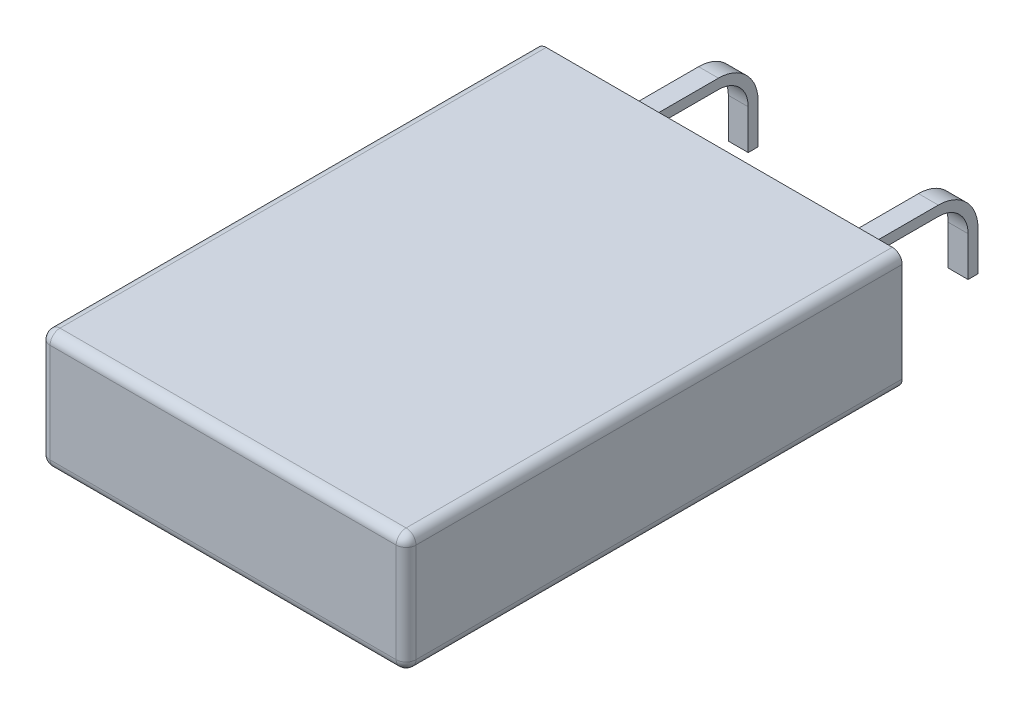
ISO-10303-21;
HEADER;
FILE_DESCRIPTION(('STEP AP214'),'2;1');
FILE_NAME('part.step','',(''),(''),'','','');
FILE_SCHEMA(('AUTOMOTIVE_DESIGN { 1 0 10303 214 1 1 1 1 }'));
ENDSEC;
DATA;
#1=APPLICATION_CONTEXT('core data for automotive mechanical design processes');
#2=APPLICATION_PROTOCOL_DEFINITION('international standard','automotive_design',2000,#1);
#3=PRODUCT_CONTEXT('',#1,'mechanical');
#4=PRODUCT('Part','Part','',(#3));
#5=PRODUCT_RELATED_PRODUCT_CATEGORY('part','',(#4));
#6=PRODUCT_DEFINITION_FORMATION('','',#4);
#7=PRODUCT_DEFINITION_CONTEXT('part definition',#1,'design');
#8=PRODUCT_DEFINITION('design','',#6,#7);
#9=PRODUCT_DEFINITION_SHAPE('','',#8);
#10=(LENGTH_UNIT() NAMED_UNIT(*) SI_UNIT(.MILLI.,.METRE.));
#11=(NAMED_UNIT(*) PLANE_ANGLE_UNIT() SI_UNIT($,.RADIAN.));
#12=(NAMED_UNIT(*) SI_UNIT($,.STERADIAN.) SOLID_ANGLE_UNIT());
#13=UNCERTAINTY_MEASURE_WITH_UNIT(LENGTH_MEASURE(1.E-05),#10,'distance_accuracy_value','');
#14=(GEOMETRIC_REPRESENTATION_CONTEXT(3) GLOBAL_UNCERTAINTY_ASSIGNED_CONTEXT((#13)) GLOBAL_UNIT_ASSIGNED_CONTEXT((#10,
#11,#12)) REPRESENTATION_CONTEXT('',''));
#15=CARTESIAN_POINT('',(0.,0.,0.));
#16=DIRECTION('',(0.,0.,1.));
#17=DIRECTION('',(1.,0.,0.));
#18=AXIS2_PLACEMENT_3D('',#15,#16,#17);
#19=CARTESIAN_POINT('',(17.44,5.,-20.));
#20=DIRECTION('',(0.,0.,-1.));
#21=DIRECTION('',(-1.,0.,0.));
#22=AXIS2_PLACEMENT_3D('',#19,#20,#21);
#23=PLANE('',#22);
#24=DIRECTION('',(1.,0.,0.));
#25=VECTOR('',#24,1.);
#26=CARTESIAN_POINT('',(1.,5.,-20.));
#27=LINE('',#26,#25);
#28=CARTESIAN_POINT('',(1.,5.,-20.));
#29=VERTEX_POINT('',#28);
#30=CARTESIAN_POINT('',(17.44,5.,-20.));
#31=VERTEX_POINT('',#30);
#32=EDGE_CURVE('E371',#29,#31,#27,.T.);
#33=ORIENTED_EDGE('',*,*,#32,.T.);
#34=DIRECTION('',(0.,-1.,0.));
#35=VECTOR('',#34,1.);
#36=CARTESIAN_POINT('',(17.44,5.,-20.));
#37=LINE('',#36,#35);
#38=CARTESIAN_POINT('',(17.44,1.,-20.));
#39=VERTEX_POINT('',#38);
#40=EDGE_CURVE('E374',#31,#39,#37,.T.);
#41=ORIENTED_EDGE('',*,*,#40,.T.);
#42=DIRECTION('',(-1.,0.,0.));
#43=VECTOR('',#42,1.);
#44=CARTESIAN_POINT('',(17.44,1.,-20.));
#45=LINE('',#44,#43);
#46=CARTESIAN_POINT('',(1.,1.,-20.));
#47=VERTEX_POINT('',#46);
#48=EDGE_CURVE('E378',#39,#47,#45,.T.);
#49=ORIENTED_EDGE('',*,*,#48,.T.);
#50=DIRECTION('',(0.,1.,0.));
#51=VECTOR('',#50,1.);
#52=CARTESIAN_POINT('',(1.,1.,-20.));
#53=LINE('',#52,#51);
#54=EDGE_CURVE('E381',#47,#29,#53,.T.);
#55=ORIENTED_EDGE('',*,*,#54,.T.);
#56=EDGE_LOOP('',(#33,#41,#49,#55));
#57=FACE_BOUND('',#56,.T.);
#58=DIRECTION('',(-1.,0.,0.));
#59=VECTOR('',#58,1.);
#60=CARTESIAN_POINT('',(15.26,3.5,-20.));
#61=LINE('',#60,#59);
#62=CARTESIAN_POINT('',(15.26,3.5,-20.));
#63=VERTEX_POINT('',#62);
#64=CARTESIAN_POINT('',(14.26,3.5,-20.));
#65=VERTEX_POINT('',#64);
#66=EDGE_CURVE('E315',#63,#65,#61,.T.);
#67=ORIENTED_EDGE('',*,*,#66,.F.);
#68=DIRECTION('',(0.,-1.,0.));
#69=VECTOR('',#68,1.);
#70=CARTESIAN_POINT('',(15.26,4.,-20.));
#71=LINE('',#70,#69);
#72=CARTESIAN_POINT('',(15.26,4.,-20.));
#73=VERTEX_POINT('',#72);
#74=EDGE_CURVE('E304',#73,#63,#71,.T.);
#75=ORIENTED_EDGE('',*,*,#74,.F.);
#76=DIRECTION('',(1.,0.,0.));
#77=VECTOR('',#76,1.);
#78=CARTESIAN_POINT('',(15.26,4.,-20.));
#79=LINE('',#78,#77);
#80=CARTESIAN_POINT('',(14.26,4.,-20.));
#81=VERTEX_POINT('',#80);
#82=EDGE_CURVE('E309',#81,#73,#79,.T.);
#83=ORIENTED_EDGE('',*,*,#82,.F.);
#84=DIRECTION('',(0.,1.,0.));
#85=VECTOR('',#84,1.);
#86=CARTESIAN_POINT('',(14.26,4.,-20.));
#87=LINE('',#86,#85);
#88=EDGE_CURVE('E317',#65,#81,#87,.T.);
#89=ORIENTED_EDGE('',*,*,#88,.F.);
#90=EDGE_LOOP('',(#67,#75,#83,#89));
#91=FACE_BOUND('',#90,.T.);
#92=DIRECTION('',(0.,-1.,0.));
#93=VECTOR('',#92,1.);
#94=CARTESIAN_POINT('',(4.18,4.,-20.));
#95=LINE('',#94,#93);
#96=CARTESIAN_POINT('',(4.18,4.,-20.));
#97=VERTEX_POINT('',#96);
#98=CARTESIAN_POINT('',(4.18,3.5,-20.));
#99=VERTEX_POINT('',#98);
#100=EDGE_CURVE('E1036',#97,#99,#95,.T.);
#101=ORIENTED_EDGE('',*,*,#100,.F.);
#102=DIRECTION('',(1.,0.,0.));
#103=VECTOR('',#102,1.);
#104=CARTESIAN_POINT('',(3.18,4.,-20.));
#105=LINE('',#104,#103);
#106=CARTESIAN_POINT('',(3.18,4.,-20.));
#107=VERTEX_POINT('',#106);
#108=EDGE_CURVE('E264',#107,#97,#105,.T.);
#109=ORIENTED_EDGE('',*,*,#108,.F.);
#110=DIRECTION('',(0.,1.,0.));
#111=VECTOR('',#110,1.);
#112=CARTESIAN_POINT('',(3.18,4.,-20.));
#113=LINE('',#112,#111);
#114=CARTESIAN_POINT('',(3.18,3.5,-20.));
#115=VERTEX_POINT('',#114);
#116=EDGE_CURVE('E260',#115,#107,#113,.T.);
#117=ORIENTED_EDGE('',*,*,#116,.F.);
#118=DIRECTION('',(-1.,0.,0.));
#119=VECTOR('',#118,1.);
#120=CARTESIAN_POINT('',(3.18,3.5,-20.));
#121=LINE('',#120,#119);
#122=EDGE_CURVE('E1034',#99,#115,#121,.T.);
#123=ORIENTED_EDGE('',*,*,#122,.F.);
#124=EDGE_LOOP('',(#101,#109,#117,#123));
#125=FACE_BOUND('',#124,.T.);
#126=ADVANCED_FACE('F39',(#57,#91,#125),#23,.T.);
#127=CARTESIAN_POINT('',(17.94,5.5,-25.));
#128=DIRECTION('',(0.,0.,1.));
#129=DIRECTION('',(1.,0.,0.));
#130=AXIS2_PLACEMENT_3D('',#127,#128,#129);
#131=CYLINDRICAL_SURFACE('',#130,0.5);
#132=DIRECTION('',(0.,0.,1.));
#133=VECTOR('',#132,1.);
#134=CARTESIAN_POINT('',(17.94,6.,-25.));
#135=LINE('',#134,#133);
#136=CARTESIAN_POINT('',(17.94,6.,-25.));
#137=VERTEX_POINT('',#136);
#138=CARTESIAN_POINT('',(17.94,6.,-0.5));
#139=VERTEX_POINT('',#138);
#140=EDGE_CURVE('E427',#137,#139,#135,.T.);
#141=ORIENTED_EDGE('',*,*,#140,.T.);
#142=CARTESIAN_POINT('',(17.94,5.5,-0.5));
#143=DIRECTION('',(0.,0.,1.));
#144=DIRECTION('',(1.,0.,0.));
#145=AXIS2_PLACEMENT_3D('',#142,#143,#144);
#146=CIRCLE('',#145,0.5);
#147=CARTESIAN_POINT('',(18.44,5.5,-0.5));
#148=VERTEX_POINT('',#147);
#149=EDGE_CURVE('E431',#139,#148,#146,.F.);
#150=ORIENTED_EDGE('',*,*,#149,.T.);
#151=DIRECTION('',(0.,0.,1.));
#152=VECTOR('',#151,1.);
#153=CARTESIAN_POINT('',(18.44,5.5,-25.));
#154=LINE('',#153,#152);
#155=CARTESIAN_POINT('',(18.44,5.5,-25.));
#156=VERTEX_POINT('',#155);
#157=EDGE_CURVE('E428',#156,#148,#154,.T.);
#158=ORIENTED_EDGE('',*,*,#157,.F.);
#159=CARTESIAN_POINT('',(17.94,5.5,-25.));
#160=DIRECTION('',(0.,0.,1.));
#161=DIRECTION('',(-1.,0.,0.));
#162=AXIS2_PLACEMENT_3D('',#159,#160,#161);
#163=CIRCLE('',#162,0.5);
#164=EDGE_CURVE('E403',#156,#137,#163,.T.);
#165=ORIENTED_EDGE('',*,*,#164,.T.);
#166=EDGE_LOOP('',(#141,#150,#158,#165));
#167=FACE_BOUND('',#166,.T.);
#168=ADVANCED_FACE('F540',(#167),#131,.T.);
#169=CARTESIAN_POINT('',(18.44,0.500000000000003,-25.));
#170=DIRECTION('',(1.,0.,0.));
#171=DIRECTION('',(0.,0.,-1.));
#172=AXIS2_PLACEMENT_3D('',#169,#170,#171);
#173=PLANE('',#172);
#174=ORIENTED_EDGE('',*,*,#157,.T.);
#175=DIRECTION('',(0.,1.,0.));
#176=VECTOR('',#175,1.);
#177=CARTESIAN_POINT('',(18.44,0.500000000000003,-0.5));
#178=LINE('',#177,#176);
#179=CARTESIAN_POINT('',(18.44,0.500000000000003,-0.5));
#180=VERTEX_POINT('',#179);
#181=EDGE_CURVE('E463',#148,#180,#178,.F.);
#182=ORIENTED_EDGE('',*,*,#181,.T.);
#183=DIRECTION('',(0.,0.,1.));
#184=VECTOR('',#183,1.);
#185=CARTESIAN_POINT('',(18.44,0.500000000000003,-25.));
#186=LINE('',#185,#184);
#187=CARTESIAN_POINT('',(18.44,0.500000000000003,-25.));
#188=VERTEX_POINT('',#187);
#189=EDGE_CURVE('E432',#188,#180,#186,.T.);
#190=ORIENTED_EDGE('',*,*,#189,.F.);
#191=DIRECTION('',(0.,1.,0.));
#192=VECTOR('',#191,1.);
#193=CARTESIAN_POINT('',(18.44,0.500000000000003,-25.));
#194=LINE('',#193,#192);
#195=EDGE_CURVE('E424',#188,#156,#194,.T.);
#196=ORIENTED_EDGE('',*,*,#195,.T.);
#197=EDGE_LOOP('',(#174,#182,#190,#196));
#198=FACE_BOUND('',#197,.T.);
#199=ADVANCED_FACE('F541',(#198),#173,.T.);
#200=CARTESIAN_POINT('',(17.94,0.5,-25.));
#201=DIRECTION('',(0.,0.,1.));
#202=DIRECTION('',(1.,0.,0.));
#203=AXIS2_PLACEMENT_3D('',#200,#201,#202);
#204=CYLINDRICAL_SURFACE('',#203,0.5);
#205=ORIENTED_EDGE('',*,*,#189,.T.);
#206=CARTESIAN_POINT('',(17.94,0.5,-0.5));
#207=DIRECTION('',(0.,0.,1.));
#208=DIRECTION('',(1.,0.,0.));
#209=AXIS2_PLACEMENT_3D('',#206,#207,#208);
#210=CIRCLE('',#209,0.5);
#211=CARTESIAN_POINT('',(17.94,0.,-0.5));
#212=VERTEX_POINT('',#211);
#213=EDGE_CURVE('E465',#180,#212,#210,.F.);
#214=ORIENTED_EDGE('',*,*,#213,.T.);
#215=DIRECTION('',(0.,0.,1.));
#216=VECTOR('',#215,1.);
#217=CARTESIAN_POINT('',(17.94,0.,-25.));
#218=LINE('',#217,#216);
#219=CARTESIAN_POINT('',(17.94,0.,-25.));
#220=VERTEX_POINT('',#219);
#221=EDGE_CURVE('E435',#220,#212,#218,.T.);
#222=ORIENTED_EDGE('',*,*,#221,.F.);
#223=CARTESIAN_POINT('',(17.94,0.5,-25.));
#224=DIRECTION('',(0.,0.,1.));
#225=DIRECTION('',(1.,0.,0.));
#226=AXIS2_PLACEMENT_3D('',#223,#224,#225);
#227=CIRCLE('',#226,0.5);
#228=EDGE_CURVE('E421',#220,#188,#227,.T.);
#229=ORIENTED_EDGE('',*,*,#228,.T.);
#230=EDGE_LOOP('',(#205,#214,#222,#229));
#231=FACE_BOUND('',#230,.T.);
#232=ADVANCED_FACE('F547',(#231),#204,.T.);
#233=CARTESIAN_POINT('',(0.500000000000003,0.,-25.));
#234=DIRECTION('',(0.,-1.,0.));
#235=DIRECTION('',(0.,0.,-1.));
#236=AXIS2_PLACEMENT_3D('',#233,#234,#235);
#237=PLANE('',#236);
#238=ORIENTED_EDGE('',*,*,#221,.T.);
#239=DIRECTION('',(1.,0.,0.));
#240=VECTOR('',#239,1.);
#241=CARTESIAN_POINT('',(0.500000000000004,0.,-0.5));
#242=LINE('',#241,#240);
#243=CARTESIAN_POINT('',(0.500000000000004,0.,-0.5));
#244=VERTEX_POINT('',#243);
#245=EDGE_CURVE('E467',#212,#244,#242,.F.);
#246=ORIENTED_EDGE('',*,*,#245,.T.);
#247=DIRECTION('',(0.,0.,1.));
#248=VECTOR('',#247,1.);
#249=CARTESIAN_POINT('',(0.500000000000004,0.,-25.));
#250=LINE('',#249,#248);
#251=CARTESIAN_POINT('',(0.500000000000004,0.,-25.));
#252=VERTEX_POINT('',#251);
#253=EDGE_CURVE('E438',#252,#244,#250,.T.);
#254=ORIENTED_EDGE('',*,*,#253,.F.);
#255=DIRECTION('',(1.,0.,0.));
#256=VECTOR('',#255,1.);
#257=CARTESIAN_POINT('',(0.500000000000003,0.,-25.));
#258=LINE('',#257,#256);
#259=EDGE_CURVE('E418',#252,#220,#258,.T.);
#260=ORIENTED_EDGE('',*,*,#259,.T.);
#261=EDGE_LOOP('',(#238,#246,#254,#260));
#262=FACE_BOUND('',#261,.T.);
#263=ADVANCED_FACE('F546',(#262),#237,.T.);
#264=CARTESIAN_POINT('',(0.5,0.5,-25.));
#265=DIRECTION('',(0.,0.,1.));
#266=DIRECTION('',(1.,0.,0.));
#267=AXIS2_PLACEMENT_3D('',#264,#265,#266);
#268=CYLINDRICAL_SURFACE('',#267,0.5);
#269=ORIENTED_EDGE('',*,*,#253,.T.);
#270=CARTESIAN_POINT('',(0.5,0.5,-0.5));
#271=DIRECTION('',(0.,0.,1.));
#272=DIRECTION('',(1.,0.,0.));
#273=AXIS2_PLACEMENT_3D('',#270,#271,#272);
#274=CIRCLE('',#273,0.5);
#275=CARTESIAN_POINT('',(0.,0.500000000000003,-0.5));
#276=VERTEX_POINT('',#275);
#277=EDGE_CURVE('E469',#244,#276,#274,.F.);
#278=ORIENTED_EDGE('',*,*,#277,.T.);
#279=DIRECTION('',(0.,0.,1.));
#280=VECTOR('',#279,1.);
#281=CARTESIAN_POINT('',(0.,0.500000000000003,-25.));
#282=LINE('',#281,#280);
#283=CARTESIAN_POINT('',(0.,0.500000000000003,-25.));
#284=VERTEX_POINT('',#283);
#285=EDGE_CURVE('E441',#284,#276,#282,.T.);
#286=ORIENTED_EDGE('',*,*,#285,.F.);
#287=CARTESIAN_POINT('',(0.5,0.5,-25.));
#288=DIRECTION('',(0.,0.,1.));
#289=DIRECTION('',(-1.,0.,0.));
#290=AXIS2_PLACEMENT_3D('',#287,#288,#289);
#291=CIRCLE('',#290,0.5);
#292=EDGE_CURVE('E415',#284,#252,#291,.T.);
#293=ORIENTED_EDGE('',*,*,#292,.T.);
#294=EDGE_LOOP('',(#269,#278,#286,#293));
#295=FACE_BOUND('',#294,.T.);
#296=ADVANCED_FACE('F504',(#295),#268,.T.);
#297=CARTESIAN_POINT('',(0.,0.500000000000003,-25.));
#298=DIRECTION('',(-1.,0.,0.));
#299=DIRECTION('',(0.,0.,1.));
#300=AXIS2_PLACEMENT_3D('',#297,#298,#299);
#301=PLANE('',#300);
#302=ORIENTED_EDGE('',*,*,#285,.T.);
#303=DIRECTION('',(0.,-1.,0.));
#304=VECTOR('',#303,1.);
#305=CARTESIAN_POINT('',(0.,5.5,-0.5));
#306=LINE('',#305,#304);
#307=CARTESIAN_POINT('',(0.,5.5,-0.5));
#308=VERTEX_POINT('',#307);
#309=EDGE_CURVE('E471',#276,#308,#306,.F.);
#310=ORIENTED_EDGE('',*,*,#309,.T.);
#311=DIRECTION('',(0.,0.,1.));
#312=VECTOR('',#311,1.);
#313=CARTESIAN_POINT('',(0.,5.5,-25.));
#314=LINE('',#313,#312);
#315=CARTESIAN_POINT('',(0.,5.5,-25.));
#316=VERTEX_POINT('',#315);
#317=EDGE_CURVE('E444',#316,#308,#314,.T.);
#318=ORIENTED_EDGE('',*,*,#317,.F.);
#319=DIRECTION('',(0.,-1.,0.));
#320=VECTOR('',#319,1.);
#321=CARTESIAN_POINT('',(0.,0.500000000000003,-25.));
#322=LINE('',#321,#320);
#323=EDGE_CURVE('E412',#316,#284,#322,.T.);
#324=ORIENTED_EDGE('',*,*,#323,.T.);
#325=EDGE_LOOP('',(#302,#310,#318,#324));
#326=FACE_BOUND('',#325,.T.);
#327=ADVANCED_FACE('F507',(#326),#301,.T.);
#328=CARTESIAN_POINT('',(0.5,5.5,-25.));
#329=DIRECTION('',(0.,0.,1.));
#330=DIRECTION('',(1.,0.,0.));
#331=AXIS2_PLACEMENT_3D('',#328,#329,#330);
#332=CYLINDRICAL_SURFACE('',#331,0.5);
#333=ORIENTED_EDGE('',*,*,#317,.T.);
#334=CARTESIAN_POINT('',(0.5,5.5,-0.5));
#335=DIRECTION('',(0.,0.,1.));
#336=DIRECTION('',(1.,0.,0.));
#337=AXIS2_PLACEMENT_3D('',#334,#335,#336);
#338=CIRCLE('',#337,0.5);
#339=CARTESIAN_POINT('',(0.500000000000003,6.,-0.5));
#340=VERTEX_POINT('',#339);
#341=EDGE_CURVE('E48',#308,#340,#338,.F.);
#342=ORIENTED_EDGE('',*,*,#341,.T.);
#343=DIRECTION('',(0.,0.,1.));
#344=VECTOR('',#343,1.);
#345=CARTESIAN_POINT('',(0.500000000000003,6.,-25.));
#346=LINE('',#345,#344);
#347=CARTESIAN_POINT('',(0.500000000000003,6.,-25.));
#348=VERTEX_POINT('',#347);
#349=EDGE_CURVE('E447',#348,#340,#346,.T.);
#350=ORIENTED_EDGE('',*,*,#349,.F.);
#351=CARTESIAN_POINT('',(0.5,5.5,-25.));
#352=DIRECTION('',(0.,0.,1.));
#353=DIRECTION('',(-1.,0.,0.));
#354=AXIS2_PLACEMENT_3D('',#351,#352,#353);
#355=CIRCLE('',#354,0.5);
#356=EDGE_CURVE('E409',#348,#316,#355,.T.);
#357=ORIENTED_EDGE('',*,*,#356,.T.);
#358=EDGE_LOOP('',(#333,#342,#350,#357));
#359=FACE_BOUND('',#358,.T.);
#360=ADVANCED_FACE('F516',(#359),#332,.T.);
#361=CARTESIAN_POINT('',(0.500000000000003,6.,-25.));
#362=DIRECTION('',(0.,1.,0.));
#363=DIRECTION('',(0.,0.,1.));
#364=AXIS2_PLACEMENT_3D('',#361,#362,#363);
#365=PLANE('',#364);
#366=ORIENTED_EDGE('',*,*,#349,.T.);
#367=DIRECTION('',(-1.,0.,0.));
#368=VECTOR('',#367,1.);
#369=CARTESIAN_POINT('',(17.94,6.,-0.5));
#370=LINE('',#369,#368);
#371=EDGE_CURVE('E11',#340,#139,#370,.F.);
#372=ORIENTED_EDGE('',*,*,#371,.T.);
#373=ORIENTED_EDGE('',*,*,#140,.F.);
#374=DIRECTION('',(-1.,0.,0.));
#375=VECTOR('',#374,1.);
#376=CARTESIAN_POINT('',(0.500000000000003,6.,-25.));
#377=LINE('',#376,#375);
#378=EDGE_CURVE('E406',#137,#348,#377,.T.);
#379=ORIENTED_EDGE('',*,*,#378,.T.);
#380=EDGE_LOOP('',(#366,#372,#373,#379));
#381=FACE_BOUND('',#380,.T.);
#382=ADVANCED_FACE('F521',(#381),#365,.T.);
#383=CARTESIAN_POINT('',(17.94,5.5,-25.));
#384=DIRECTION('',(0.,0.,-1.));
#385=DIRECTION('',(-1.,0.,0.));
#386=AXIS2_PLACEMENT_3D('',#383,#384,#385);
#387=PLANE('',#386);
#388=DIRECTION('',(1.,0.,0.));
#389=VECTOR('',#388,1.);
#390=CARTESIAN_POINT('',(1.,5.,-25.));
#391=LINE('',#390,#389);
#392=CARTESIAN_POINT('',(1.,5.,-25.));
#393=VERTEX_POINT('',#392);
#394=CARTESIAN_POINT('',(17.44,5.,-25.));
#395=VERTEX_POINT('',#394);
#396=EDGE_CURVE('E370',#393,#395,#391,.T.);
#397=ORIENTED_EDGE('',*,*,#396,.F.);
#398=DIRECTION('',(0.,1.,0.));
#399=VECTOR('',#398,1.);
#400=CARTESIAN_POINT('',(1.,1.,-25.));
#401=LINE('',#400,#399);
#402=CARTESIAN_POINT('',(1.,1.,-25.));
#403=VERTEX_POINT('',#402);
#404=EDGE_CURVE('E375',#403,#393,#401,.T.);
#405=ORIENTED_EDGE('',*,*,#404,.F.);
#406=DIRECTION('',(-1.,0.,0.));
#407=VECTOR('',#406,1.);
#408=CARTESIAN_POINT('',(17.44,1.,-25.));
#409=LINE('',#408,#407);
#410=CARTESIAN_POINT('',(17.44,1.,-25.));
#411=VERTEX_POINT('',#410);
#412=EDGE_CURVE('E389',#411,#403,#409,.T.);
#413=ORIENTED_EDGE('',*,*,#412,.F.);
#414=DIRECTION('',(0.,-1.,0.));
#415=VECTOR('',#414,1.);
#416=CARTESIAN_POINT('',(17.44,5.,-25.));
#417=LINE('',#416,#415);
#418=EDGE_CURVE('E386',#395,#411,#417,.T.);
#419=ORIENTED_EDGE('',*,*,#418,.F.);
#420=EDGE_LOOP('',(#397,#405,#413,#419));
#421=FACE_BOUND('',#420,.T.);
#422=ORIENTED_EDGE('',*,*,#164,.F.);
#423=ORIENTED_EDGE('',*,*,#195,.F.);
#424=ORIENTED_EDGE('',*,*,#228,.F.);
#425=ORIENTED_EDGE('',*,*,#259,.F.);
#426=ORIENTED_EDGE('',*,*,#292,.F.);
#427=ORIENTED_EDGE('',*,*,#323,.F.);
#428=ORIENTED_EDGE('',*,*,#356,.F.);
#429=ORIENTED_EDGE('',*,*,#378,.F.);
#430=EDGE_LOOP('',(#422,#423,#424,#425,#426,#427,#428,#429));
#431=FACE_BOUND('',#430,.T.);
#432=ADVANCED_FACE('F512',(#421,#431),#387,.T.);
#433=CARTESIAN_POINT('',(17.94,5.5,0.));
#434=DIRECTION('',(0.,0.,-1.));
#435=DIRECTION('',(-1.,0.,0.));
#436=AXIS2_PLACEMENT_3D('',#433,#434,#435);
#437=PLANE('',#436);
#438=DIRECTION('',(1.,0.,0.));
#439=VECTOR('',#438,1.);
#440=CARTESIAN_POINT('',(17.94,0.5,0.));
#441=LINE('',#440,#439);
#442=CARTESIAN_POINT('',(0.5,0.5,0.));
#443=VERTEX_POINT('',#442);
#444=CARTESIAN_POINT('',(17.94,0.5,0.));
#445=VERTEX_POINT('',#444);
#446=EDGE_CURVE('E458',#443,#445,#441,.T.);
#447=ORIENTED_EDGE('',*,*,#446,.T.);
#448=DIRECTION('',(0.,1.,0.));
#449=VECTOR('',#448,1.);
#450=CARTESIAN_POINT('',(17.94,5.5,0.));
#451=LINE('',#450,#449);
#452=CARTESIAN_POINT('',(17.94,5.5,0.));
#453=VERTEX_POINT('',#452);
#454=EDGE_CURVE('E460',#445,#453,#451,.T.);
#455=ORIENTED_EDGE('',*,*,#454,.T.);
#456=DIRECTION('',(-1.,0.,0.));
#457=VECTOR('',#456,1.);
#458=CARTESIAN_POINT('',(0.500000000000004,5.5,0.));
#459=LINE('',#458,#457);
#460=CARTESIAN_POINT('',(0.5,5.5,0.));
#461=VERTEX_POINT('',#460);
#462=EDGE_CURVE('E454',#453,#461,#459,.T.);
#463=ORIENTED_EDGE('',*,*,#462,.T.);
#464=DIRECTION('',(0.,-1.,0.));
#465=VECTOR('',#464,1.);
#466=CARTESIAN_POINT('',(0.5,0.500000000000003,0.));
#467=LINE('',#466,#465);
#468=EDGE_CURVE('E456',#461,#443,#467,.T.);
#469=ORIENTED_EDGE('',*,*,#468,.T.);
#470=EDGE_LOOP('',(#447,#455,#463,#469));
#471=FACE_BOUND('',#470,.T.);
#472=ADVANCED_FACE('F590',(#471),#437,.F.);
#473=CARTESIAN_POINT('',(0.5,0.5,-0.5));
#474=DIRECTION('',(0.,0.,1.));
#475=DIRECTION('',(1.,0.,0.));
#476=AXIS2_PLACEMENT_3D('',#473,#474,#475);
#477=SPHERICAL_SURFACE('',#476,0.5);
#478=CARTESIAN_POINT('',(0.5,0.5,-0.5));
#479=DIRECTION('',(0.,1.,0.));
#480=DIRECTION('',(-1.,0.,0.));
#481=AXIS2_PLACEMENT_3D('',#478,#479,#480);
#482=CIRCLE('',#481,0.5);
#483=EDGE_CURVE('E488',#276,#443,#482,.T.);
#484=ORIENTED_EDGE('',*,*,#483,.F.);
#485=ORIENTED_EDGE('',*,*,#277,.F.);
#486=CARTESIAN_POINT('',(0.5,0.5,-0.5));
#487=DIRECTION('',(1.,0.,0.));
#488=DIRECTION('',(0.,1.,0.));
#489=AXIS2_PLACEMENT_3D('',#486,#487,#488);
#490=CIRCLE('',#489,0.5);
#491=EDGE_CURVE('E43',#443,#244,#490,.T.);
#492=ORIENTED_EDGE('',*,*,#491,.F.);
#493=EDGE_LOOP('',(#484,#485,#492));
#494=FACE_BOUND('',#493,.T.);
#495=ADVANCED_FACE('F41',(#494),#477,.T.);
#496=CARTESIAN_POINT('',(17.94,0.5,-0.5));
#497=DIRECTION('',(-1.,0.,0.));
#498=DIRECTION('',(0.,0.,1.));
#499=AXIS2_PLACEMENT_3D('',#496,#497,#498);
#500=CYLINDRICAL_SURFACE('',#499,0.5);
#501=ORIENTED_EDGE('',*,*,#491,.T.);
#502=ORIENTED_EDGE('',*,*,#245,.F.);
#503=CARTESIAN_POINT('',(17.94,0.5,-0.5));
#504=DIRECTION('',(1.,0.,0.));
#505=DIRECTION('',(0.,1.,0.));
#506=AXIS2_PLACEMENT_3D('',#503,#504,#505);
#507=CIRCLE('',#506,0.5);
#508=EDGE_CURVE('E486',#445,#212,#507,.T.);
#509=ORIENTED_EDGE('',*,*,#508,.F.);
#510=ORIENTED_EDGE('',*,*,#446,.F.);
#511=EDGE_LOOP('',(#501,#502,#509,#510));
#512=FACE_BOUND('',#511,.T.);
#513=ADVANCED_FACE('F499',(#512),#500,.T.);
#514=CARTESIAN_POINT('',(0.5,5.5,-0.5));
#515=DIRECTION('',(0.,1.,0.));
#516=DIRECTION('',(0.,0.,1.));
#517=AXIS2_PLACEMENT_3D('',#514,#515,#516);
#518=CYLINDRICAL_SURFACE('',#517,0.5);
#519=ORIENTED_EDGE('',*,*,#483,.T.);
#520=ORIENTED_EDGE('',*,*,#468,.F.);
#521=CARTESIAN_POINT('',(0.5,5.5,-0.5));
#522=DIRECTION('',(0.,1.,0.));
#523=DIRECTION('',(0.,0.,1.));
#524=AXIS2_PLACEMENT_3D('',#521,#522,#523);
#525=CIRCLE('',#524,0.5);
#526=EDGE_CURVE('E483',#308,#461,#525,.T.);
#527=ORIENTED_EDGE('',*,*,#526,.F.);
#528=ORIENTED_EDGE('',*,*,#309,.F.);
#529=EDGE_LOOP('',(#519,#520,#527,#528));
#530=FACE_BOUND('',#529,.T.);
#531=ADVANCED_FACE('F552',(#530),#518,.T.);
#532=CARTESIAN_POINT('',(17.94,0.5,-0.5));
#533=DIRECTION('',(0.,0.,1.));
#534=DIRECTION('',(1.,0.,0.));
#535=AXIS2_PLACEMENT_3D('',#532,#533,#534);
#536=SPHERICAL_SURFACE('',#535,0.5);
#537=ORIENTED_EDGE('',*,*,#508,.T.);
#538=ORIENTED_EDGE('',*,*,#213,.F.);
#539=CARTESIAN_POINT('',(17.94,0.5,-0.5));
#540=DIRECTION('',(0.,1.,0.));
#541=DIRECTION('',(-1.,0.,0.));
#542=AXIS2_PLACEMENT_3D('',#539,#540,#541);
#543=CIRCLE('',#542,0.5);
#544=EDGE_CURVE('E480',#445,#180,#543,.T.);
#545=ORIENTED_EDGE('',*,*,#544,.F.);
#546=EDGE_LOOP('',(#537,#538,#545));
#547=FACE_BOUND('',#546,.T.);
#548=ADVANCED_FACE('F550',(#547),#536,.T.);
#549=CARTESIAN_POINT('',(0.5,5.5,-0.5));
#550=DIRECTION('',(0.,0.,1.));
#551=DIRECTION('',(1.,0.,0.));
#552=AXIS2_PLACEMENT_3D('',#549,#550,#551);
#553=SPHERICAL_SURFACE('',#552,0.5);
#554=ORIENTED_EDGE('',*,*,#341,.F.);
#555=ORIENTED_EDGE('',*,*,#526,.T.);
#556=CARTESIAN_POINT('',(0.5,5.5,-0.5));
#557=DIRECTION('',(1.,0.,0.));
#558=DIRECTION('',(0.,1.,0.));
#559=AXIS2_PLACEMENT_3D('',#556,#557,#558);
#560=CIRCLE('',#559,0.5);
#561=EDGE_CURVE('E477',#340,#461,#560,.T.);
#562=ORIENTED_EDGE('',*,*,#561,.F.);
#563=EDGE_LOOP('',(#554,#555,#562));
#564=FACE_BOUND('',#563,.T.);
#565=ADVANCED_FACE('F524',(#564),#553,.T.);
#566=CARTESIAN_POINT('',(17.94,5.5,-0.5));
#567=DIRECTION('',(0.,-1.,0.));
#568=DIRECTION('',(0.,0.,-1.));
#569=AXIS2_PLACEMENT_3D('',#566,#567,#568);
#570=CYLINDRICAL_SURFACE('',#569,0.5);
#571=ORIENTED_EDGE('',*,*,#544,.T.);
#572=ORIENTED_EDGE('',*,*,#181,.F.);
#573=CARTESIAN_POINT('',(17.94,5.5,-0.5));
#574=DIRECTION('',(0.,1.,0.));
#575=DIRECTION('',(-1.,0.,0.));
#576=AXIS2_PLACEMENT_3D('',#573,#574,#575);
#577=CIRCLE('',#576,0.5);
#578=EDGE_CURVE('E475',#453,#148,#577,.T.);
#579=ORIENTED_EDGE('',*,*,#578,.F.);
#580=ORIENTED_EDGE('',*,*,#454,.F.);
#581=EDGE_LOOP('',(#571,#572,#579,#580));
#582=FACE_BOUND('',#581,.T.);
#583=ADVANCED_FACE('F536',(#582),#570,.T.);
#584=CARTESIAN_POINT('',(17.94,5.5,-0.5));
#585=DIRECTION('',(1.,0.,0.));
#586=DIRECTION('',(0.,0.,-1.));
#587=AXIS2_PLACEMENT_3D('',#584,#585,#586);
#588=CYLINDRICAL_SURFACE('',#587,0.5);
#589=ORIENTED_EDGE('',*,*,#561,.T.);
#590=ORIENTED_EDGE('',*,*,#462,.F.);
#591=CARTESIAN_POINT('',(17.94,5.5,-0.5));
#592=DIRECTION('',(1.,0.,0.));
#593=DIRECTION('',(0.,0.,-1.));
#594=AXIS2_PLACEMENT_3D('',#591,#592,#593);
#595=CIRCLE('',#594,0.5);
#596=EDGE_CURVE('E396',#139,#453,#595,.T.);
#597=ORIENTED_EDGE('',*,*,#596,.F.);
#598=ORIENTED_EDGE('',*,*,#371,.F.);
#599=EDGE_LOOP('',(#589,#590,#597,#598));
#600=FACE_BOUND('',#599,.T.);
#601=ADVANCED_FACE('F528',(#600),#588,.T.);
#602=CARTESIAN_POINT('',(17.94,5.5,-0.5));
#603=DIRECTION('',(0.,0.,1.));
#604=DIRECTION('',(1.,0.,0.));
#605=AXIS2_PLACEMENT_3D('',#602,#603,#604);
#606=SPHERICAL_SURFACE('',#605,0.5);
#607=ORIENTED_EDGE('',*,*,#578,.T.);
#608=ORIENTED_EDGE('',*,*,#149,.F.);
#609=ORIENTED_EDGE('',*,*,#596,.T.);
#610=EDGE_LOOP('',(#607,#608,#609));
#611=FACE_BOUND('',#610,.T.);
#612=ADVANCED_FACE('F532',(#611),#606,.T.);
#613=CARTESIAN_POINT('',(1.,5.,-20.));
#614=DIRECTION('',(0.,1.,0.));
#615=DIRECTION('',(0.,0.,1.));
#616=AXIS2_PLACEMENT_3D('',#613,#614,#615);
#617=PLANE('',#616);
#618=ORIENTED_EDGE('',*,*,#396,.T.);
#619=DIRECTION('',(0.,0.,-1.));
#620=VECTOR('',#619,1.);
#621=CARTESIAN_POINT('',(17.44,5.,-20.));
#622=LINE('',#621,#620);
#623=EDGE_CURVE('E384',#31,#395,#622,.T.);
#624=ORIENTED_EDGE('',*,*,#623,.F.);
#625=ORIENTED_EDGE('',*,*,#32,.F.);
#626=DIRECTION('',(0.,0.,-1.));
#627=VECTOR('',#626,1.);
#628=CARTESIAN_POINT('',(1.,5.,-20.));
#629=LINE('',#628,#627);
#630=EDGE_CURVE('E394',#29,#393,#629,.T.);
#631=ORIENTED_EDGE('',*,*,#630,.T.);
#632=EDGE_LOOP('',(#618,#624,#625,#631));
#633=FACE_BOUND('',#632,.T.);
#634=ADVANCED_FACE('F576',(#633),#617,.F.);
#635=CARTESIAN_POINT('',(1.,1.,-20.));
#636=DIRECTION('',(-1.,0.,0.));
#637=DIRECTION('',(0.,0.,1.));
#638=AXIS2_PLACEMENT_3D('',#635,#636,#637);
#639=PLANE('',#638);
#640=ORIENTED_EDGE('',*,*,#404,.T.);
#641=ORIENTED_EDGE('',*,*,#630,.F.);
#642=ORIENTED_EDGE('',*,*,#54,.F.);
#643=DIRECTION('',(0.,0.,-1.));
#644=VECTOR('',#643,1.);
#645=CARTESIAN_POINT('',(1.,1.,-20.));
#646=LINE('',#645,#644);
#647=EDGE_CURVE('E397',#47,#403,#646,.T.);
#648=ORIENTED_EDGE('',*,*,#647,.T.);
#649=EDGE_LOOP('',(#640,#641,#642,#648));
#650=FACE_BOUND('',#649,.T.);
#651=ADVANCED_FACE('F572',(#650),#639,.F.);
#652=CARTESIAN_POINT('',(17.44,1.,-20.));
#653=DIRECTION('',(0.,-1.,0.));
#654=DIRECTION('',(0.,0.,-1.));
#655=AXIS2_PLACEMENT_3D('',#652,#653,#654);
#656=PLANE('',#655);
#657=ORIENTED_EDGE('',*,*,#412,.T.);
#658=ORIENTED_EDGE('',*,*,#647,.F.);
#659=ORIENTED_EDGE('',*,*,#48,.F.);
#660=DIRECTION('',(0.,0.,-1.));
#661=VECTOR('',#660,1.);
#662=CARTESIAN_POINT('',(17.44,1.,-20.));
#663=LINE('',#662,#661);
#664=EDGE_CURVE('E399',#39,#411,#663,.T.);
#665=ORIENTED_EDGE('',*,*,#664,.T.);
#666=EDGE_LOOP('',(#657,#658,#659,#665));
#667=FACE_BOUND('',#666,.T.);
#668=ADVANCED_FACE('F575',(#667),#656,.F.);
#669=CARTESIAN_POINT('',(17.44,5.,-20.));
#670=DIRECTION('',(1.,0.,0.));
#671=DIRECTION('',(0.,0.,-1.));
#672=AXIS2_PLACEMENT_3D('',#669,#670,#671);
#673=PLANE('',#672);
#674=ORIENTED_EDGE('',*,*,#418,.T.);
#675=ORIENTED_EDGE('',*,*,#664,.F.);
#676=ORIENTED_EDGE('',*,*,#40,.F.);
#677=ORIENTED_EDGE('',*,*,#623,.T.);
#678=EDGE_LOOP('',(#674,#675,#676,#677));
#679=FACE_BOUND('',#678,.T.);
#680=ADVANCED_FACE('F580',(#679),#673,.F.);
#681=CARTESIAN_POINT('',(15.26,1.99999999999999,-31.5));
#682=DIRECTION('',(0.,0.,1.));
#683=DIRECTION('',(1.,0.,0.));
#684=AXIS2_PLACEMENT_3D('',#681,#682,#683);
#685=PLANE('',#684);
#686=DIRECTION('',(-1.,0.,0.));
#687=VECTOR('',#686,1.);
#688=CARTESIAN_POINT('',(15.26,1.99999999999999,-31.5));
#689=LINE('',#688,#687);
#690=CARTESIAN_POINT('',(15.26,1.99999999999999,-31.5));
#691=VERTEX_POINT('',#690);
#692=CARTESIAN_POINT('',(14.26,1.99999999999999,-31.5));
#693=VERTEX_POINT('',#692);
#694=EDGE_CURVE('E331',#691,#693,#689,.T.);
#695=ORIENTED_EDGE('',*,*,#694,.T.);
#696=DIRECTION('',(0.,-1.,0.));
#697=VECTOR('',#696,1.);
#698=CARTESIAN_POINT('',(14.26,1.99999999999999,-31.5));
#699=LINE('',#698,#697);
#700=CARTESIAN_POINT('',(14.26,5.66135680002411E-11,-31.5));
#701=VERTEX_POINT('',#700);
#702=EDGE_CURVE('E364',#693,#701,#699,.T.);
#703=ORIENTED_EDGE('',*,*,#702,.T.);
#704=DIRECTION('',(-1.,0.,0.));
#705=VECTOR('',#704,1.);
#706=CARTESIAN_POINT('',(15.26,5.66135680002411E-11,-31.5));
#707=LINE('',#706,#705);
#708=CARTESIAN_POINT('',(15.26,5.66135680002411E-11,-31.5));
#709=VERTEX_POINT('',#708);
#710=EDGE_CURVE('E355',#709,#701,#707,.T.);
#711=ORIENTED_EDGE('',*,*,#710,.F.);
#712=DIRECTION('',(0.,-1.,0.));
#713=VECTOR('',#712,1.);
#714=CARTESIAN_POINT('',(15.26,1.99999999999999,-31.5));
#715=LINE('',#714,#713);
#716=EDGE_CURVE('E367',#691,#709,#715,.T.);
#717=ORIENTED_EDGE('',*,*,#716,.F.);
#718=EDGE_LOOP('',(#695,#703,#711,#717));
#719=FACE_BOUND('',#718,.T.);
#720=ADVANCED_FACE('F570',(#719),#685,.T.);
#721=CARTESIAN_POINT('',(15.26,1.99999999999998,-32.));
#722=DIRECTION('',(0.,0.,-1.));
#723=DIRECTION('',(-1.,0.,0.));
#724=AXIS2_PLACEMENT_3D('',#721,#722,#723);
#725=PLANE('',#724);
#726=DIRECTION('',(1.,0.,0.));
#727=VECTOR('',#726,1.);
#728=CARTESIAN_POINT('',(15.26,1.99999999999998,-32.));
#729=LINE('',#728,#727);
#730=CARTESIAN_POINT('',(14.26,1.99999999999998,-32.));
#731=VERTEX_POINT('',#730);
#732=CARTESIAN_POINT('',(15.26,1.99999999999998,-32.));
#733=VERTEX_POINT('',#732);
#734=EDGE_CURVE('E328',#731,#733,#729,.T.);
#735=ORIENTED_EDGE('',*,*,#734,.T.);
#736=DIRECTION('',(0.,-1.,0.));
#737=VECTOR('',#736,1.);
#738=CARTESIAN_POINT('',(15.26,1.99999999999998,-32.));
#739=LINE('',#738,#737);
#740=CARTESIAN_POINT('',(15.26,5.66066291063372E-11,-32.));
#741=VERTEX_POINT('',#740);
#742=EDGE_CURVE('E358',#733,#741,#739,.T.);
#743=ORIENTED_EDGE('',*,*,#742,.T.);
#744=DIRECTION('',(1.,0.,0.));
#745=VECTOR('',#744,1.);
#746=CARTESIAN_POINT('',(15.26,5.66066291063372E-11,-32.));
#747=LINE('',#746,#745);
#748=CARTESIAN_POINT('',(14.26,5.66066291063372E-11,-32.));
#749=VERTEX_POINT('',#748);
#750=EDGE_CURVE('E349',#749,#741,#747,.T.);
#751=ORIENTED_EDGE('',*,*,#750,.F.);
#752=DIRECTION('',(0.,-1.,0.));
#753=VECTOR('',#752,1.);
#754=CARTESIAN_POINT('',(14.26,1.99999999999998,-32.));
#755=LINE('',#754,#753);
#756=EDGE_CURVE('E361',#731,#749,#755,.T.);
#757=ORIENTED_EDGE('',*,*,#756,.F.);
#758=EDGE_LOOP('',(#735,#743,#751,#757));
#759=FACE_BOUND('',#758,.T.);
#760=ADVANCED_FACE('F650',(#759),#725,.T.);
#761=CARTESIAN_POINT('',(9.22,2.,-30.));
#762=DIRECTION('',(-1.,0.,0.));
#763=DIRECTION('',(0.,0.,1.));
#764=AXIS2_PLACEMENT_3D('',#761,#762,#763);
#765=CYLINDRICAL_SURFACE('',#764,1.5);
#766=DIRECTION('',(-1.,0.,0.));
#767=VECTOR('',#766,1.);
#768=CARTESIAN_POINT('',(15.26,3.5,-30.));
#769=LINE('',#768,#767);
#770=CARTESIAN_POINT('',(15.26,3.5,-30.));
#771=VERTEX_POINT('',#770);
#772=CARTESIAN_POINT('',(14.26,3.5,-30.));
#773=VERTEX_POINT('',#772);
#774=EDGE_CURVE('E305',#771,#773,#769,.T.);
#775=ORIENTED_EDGE('',*,*,#774,.T.);
#776=CARTESIAN_POINT('',(14.26,2.,-30.));
#777=DIRECTION('',(-1.,0.,0.));
#778=DIRECTION('',(0.,0.,1.));
#779=AXIS2_PLACEMENT_3D('',#776,#777,#778);
#780=CIRCLE('',#779,1.5);
#781=EDGE_CURVE('E340',#773,#693,#780,.T.);
#782=ORIENTED_EDGE('',*,*,#781,.T.);
#783=ORIENTED_EDGE('',*,*,#694,.F.);
#784=CARTESIAN_POINT('',(15.26,2.,-30.));
#785=DIRECTION('',(-1.,0.,0.));
#786=DIRECTION('',(0.,0.,1.));
#787=AXIS2_PLACEMENT_3D('',#784,#785,#786);
#788=CIRCLE('',#787,1.5);
#789=EDGE_CURVE('E343',#771,#691,#788,.T.);
#790=ORIENTED_EDGE('',*,*,#789,.F.);
#791=EDGE_LOOP('',(#775,#782,#783,#790));
#792=FACE_BOUND('',#791,.T.);
#793=ADVANCED_FACE('F657',(#792),#765,.F.);
#794=CARTESIAN_POINT('',(9.22,2.,-30.));
#795=DIRECTION('',(-1.,0.,0.));
#796=DIRECTION('',(0.,0.,1.));
#797=AXIS2_PLACEMENT_3D('',#794,#795,#796);
#798=CYLINDRICAL_SURFACE('',#797,2.);
#799=DIRECTION('',(1.,0.,0.));
#800=VECTOR('',#799,1.);
#801=CARTESIAN_POINT('',(15.26,4.,-30.));
#802=LINE('',#801,#800);
#803=CARTESIAN_POINT('',(14.26,4.,-30.));
#804=VERTEX_POINT('',#803);
#805=CARTESIAN_POINT('',(15.26,4.,-30.));
#806=VERTEX_POINT('',#805);
#807=EDGE_CURVE('E308',#804,#806,#802,.T.);
#808=ORIENTED_EDGE('',*,*,#807,.T.);
#809=CARTESIAN_POINT('',(15.26,2.,-30.));
#810=DIRECTION('',(-1.,0.,0.));
#811=DIRECTION('',(0.,0.,1.));
#812=AXIS2_PLACEMENT_3D('',#809,#810,#811);
#813=CIRCLE('',#812,2.);
#814=EDGE_CURVE('E334',#806,#733,#813,.T.);
#815=ORIENTED_EDGE('',*,*,#814,.T.);
#816=ORIENTED_EDGE('',*,*,#734,.F.);
#817=CARTESIAN_POINT('',(14.26,2.,-30.));
#818=DIRECTION('',(-1.,0.,0.));
#819=DIRECTION('',(0.,0.,1.));
#820=AXIS2_PLACEMENT_3D('',#817,#818,#819);
#821=CIRCLE('',#820,2.);
#822=EDGE_CURVE('E337',#804,#731,#821,.T.);
#823=ORIENTED_EDGE('',*,*,#822,.F.);
#824=EDGE_LOOP('',(#808,#815,#816,#823));
#825=FACE_BOUND('',#824,.T.);
#826=ADVANCED_FACE('F664',(#825),#798,.T.);
#827=CARTESIAN_POINT('',(15.26,4.,-30.));
#828=DIRECTION('',(-1.,0.,0.));
#829=DIRECTION('',(0.,-1.,0.));
#830=AXIS2_PLACEMENT_3D('',#827,#828,#829);
#831=PLANE('',#830);
#832=ORIENTED_EDGE('',*,*,#74,.T.);
#833=DIRECTION('',(0.,0.,1.));
#834=VECTOR('',#833,1.);
#835=CARTESIAN_POINT('',(15.26,3.5,-30.));
#836=LINE('',#835,#834);
#837=EDGE_CURVE('E326',#771,#63,#836,.T.);
#838=ORIENTED_EDGE('',*,*,#837,.F.);
#839=ORIENTED_EDGE('',*,*,#789,.T.);
#840=ORIENTED_EDGE('',*,*,#716,.T.);
#841=DIRECTION('',(0.,0.,1.));
#842=VECTOR('',#841,1.);
#843=CARTESIAN_POINT('',(15.26,5.66066291063372E-11,-32.));
#844=LINE('',#843,#842);
#845=EDGE_CURVE('E346',#741,#709,#844,.T.);
#846=ORIENTED_EDGE('',*,*,#845,.F.);
#847=ORIENTED_EDGE('',*,*,#742,.F.);
#848=ORIENTED_EDGE('',*,*,#814,.F.);
#849=DIRECTION('',(0.,0.,1.));
#850=VECTOR('',#849,1.);
#851=CARTESIAN_POINT('',(15.26,4.,-30.));
#852=LINE('',#851,#850);
#853=EDGE_CURVE('E312',#806,#73,#852,.T.);
#854=ORIENTED_EDGE('',*,*,#853,.T.);
#855=EDGE_LOOP('',(#832,#838,#839,#840,#846,#847,#848,#854));
#856=FACE_BOUND('',#855,.T.);
#857=ADVANCED_FACE('F672',(#856),#831,.F.);
#858=CARTESIAN_POINT('',(15.26,3.5,-30.));
#859=DIRECTION('',(0.,1.,0.));
#860=DIRECTION('',(0.,0.,1.));
#861=AXIS2_PLACEMENT_3D('',#858,#859,#860);
#862=PLANE('',#861);
#863=ORIENTED_EDGE('',*,*,#66,.T.);
#864=DIRECTION('',(0.,0.,1.));
#865=VECTOR('',#864,1.);
#866=CARTESIAN_POINT('',(14.26,3.5,-30.));
#867=LINE('',#866,#865);
#868=EDGE_CURVE('E323',#773,#65,#867,.T.);
#869=ORIENTED_EDGE('',*,*,#868,.F.);
#870=ORIENTED_EDGE('',*,*,#774,.F.);
#871=ORIENTED_EDGE('',*,*,#837,.T.);
#872=EDGE_LOOP('',(#863,#869,#870,#871));
#873=FACE_BOUND('',#872,.T.);
#874=ADVANCED_FACE('F680',(#873),#862,.F.);
#875=CARTESIAN_POINT('',(14.26,4.,-30.));
#876=DIRECTION('',(1.,0.,0.));
#877=DIRECTION('',(0.,0.,-1.));
#878=AXIS2_PLACEMENT_3D('',#875,#876,#877);
#879=PLANE('',#878);
#880=ORIENTED_EDGE('',*,*,#88,.T.);
#881=DIRECTION('',(0.,0.,1.));
#882=VECTOR('',#881,1.);
#883=CARTESIAN_POINT('',(14.26,4.,-30.));
#884=LINE('',#883,#882);
#885=EDGE_CURVE('E64',#804,#81,#884,.T.);
#886=ORIENTED_EDGE('',*,*,#885,.F.);
#887=ORIENTED_EDGE('',*,*,#822,.T.);
#888=ORIENTED_EDGE('',*,*,#756,.T.);
#889=DIRECTION('',(0.,0.,-1.));
#890=VECTOR('',#889,1.);
#891=CARTESIAN_POINT('',(14.26,5.66066291063372E-11,-32.));
#892=LINE('',#891,#890);
#893=EDGE_CURVE('E352',#701,#749,#892,.T.);
#894=ORIENTED_EDGE('',*,*,#893,.F.);
#895=ORIENTED_EDGE('',*,*,#702,.F.);
#896=ORIENTED_EDGE('',*,*,#781,.F.);
#897=ORIENTED_EDGE('',*,*,#868,.T.);
#898=EDGE_LOOP('',(#880,#886,#887,#888,#894,#895,#896,#897));
#899=FACE_BOUND('',#898,.T.);
#900=ADVANCED_FACE('F688',(#899),#879,.F.);
#901=CARTESIAN_POINT('',(15.26,4.,-30.));
#902=DIRECTION('',(0.,-1.,0.));
#903=DIRECTION('',(0.,0.,-1.));
#904=AXIS2_PLACEMENT_3D('',#901,#902,#903);
#905=PLANE('',#904);
#906=ORIENTED_EDGE('',*,*,#82,.T.);
#907=ORIENTED_EDGE('',*,*,#853,.F.);
#908=ORIENTED_EDGE('',*,*,#807,.F.);
#909=ORIENTED_EDGE('',*,*,#885,.T.);
#910=EDGE_LOOP('',(#906,#907,#908,#909));
#911=FACE_BOUND('',#910,.T.);
#912=ADVANCED_FACE('F696',(#911),#905,.F.);
#913=CARTESIAN_POINT('',(15.26,5.66135680002411E-11,-31.5));
#914=DIRECTION('',(0.,-1.,0.));
#915=DIRECTION('',(-1.,0.,0.));
#916=AXIS2_PLACEMENT_3D('',#913,#914,#915);
#917=PLANE('',#916);
#918=ORIENTED_EDGE('',*,*,#845,.T.);
#919=ORIENTED_EDGE('',*,*,#710,.T.);
#920=ORIENTED_EDGE('',*,*,#893,.T.);
#921=ORIENTED_EDGE('',*,*,#750,.T.);
#922=EDGE_LOOP('',(#918,#919,#920,#921));
#923=FACE_BOUND('',#922,.T.);
#924=ADVANCED_FACE('F704',(#923),#917,.T.);
#925=CARTESIAN_POINT('',(3.18,1.99999999999999,-31.5));
#926=DIRECTION('',(0.,0.,1.));
#927=DIRECTION('',(1.,0.,0.));
#928=AXIS2_PLACEMENT_3D('',#925,#926,#927);
#929=PLANE('',#928);
#930=DIRECTION('',(-1.,0.,0.));
#931=VECTOR('',#930,1.);
#932=CARTESIAN_POINT('',(3.18,1.99999999999999,-31.5));
#933=LINE('',#932,#931);
#934=CARTESIAN_POINT('',(4.18,1.99999999999999,-31.5));
#935=VERTEX_POINT('',#934);
#936=CARTESIAN_POINT('',(3.18,1.99999999999999,-31.5));
#937=VERTEX_POINT('',#936);
#938=EDGE_CURVE('E269',#935,#937,#933,.T.);
#939=ORIENTED_EDGE('',*,*,#938,.T.);
#940=DIRECTION('',(0.,-1.,0.));
#941=VECTOR('',#940,1.);
#942=CARTESIAN_POINT('',(3.18,1.99999999999999,-31.5));
#943=LINE('',#942,#941);
#944=CARTESIAN_POINT('',(3.18,5.66135680002411E-11,-31.5));
#945=VERTEX_POINT('',#944);
#946=EDGE_CURVE('E297',#937,#945,#943,.T.);
#947=ORIENTED_EDGE('',*,*,#946,.T.);
#948=DIRECTION('',(-1.,0.,0.));
#949=VECTOR('',#948,1.);
#950=CARTESIAN_POINT('',(3.18,5.66135680002411E-11,-31.5));
#951=LINE('',#950,#949);
#952=CARTESIAN_POINT('',(4.18,5.66135680002411E-11,-31.5));
#953=VERTEX_POINT('',#952);
#954=EDGE_CURVE('E288',#953,#945,#951,.T.);
#955=ORIENTED_EDGE('',*,*,#954,.F.);
#956=DIRECTION('',(0.,-1.,0.));
#957=VECTOR('',#956,1.);
#958=CARTESIAN_POINT('',(4.18,1.99999999999999,-31.5));
#959=LINE('',#958,#957);
#960=EDGE_CURVE('E300',#935,#953,#959,.T.);
#961=ORIENTED_EDGE('',*,*,#960,.F.);
#962=EDGE_LOOP('',(#939,#947,#955,#961));
#963=FACE_BOUND('',#962,.T.);
#964=ADVANCED_FACE('F711',(#963),#929,.T.);
#965=CARTESIAN_POINT('',(3.18,1.99999999999998,-32.));
#966=DIRECTION('',(0.,0.,-1.));
#967=DIRECTION('',(-1.,0.,0.));
#968=AXIS2_PLACEMENT_3D('',#965,#966,#967);
#969=PLANE('',#968);
#970=DIRECTION('',(1.,0.,0.));
#971=VECTOR('',#970,1.);
#972=CARTESIAN_POINT('',(3.18,1.99999999999998,-32.));
#973=LINE('',#972,#971);
#974=CARTESIAN_POINT('',(3.18,1.99999999999998,-32.));
#975=VERTEX_POINT('',#974);
#976=CARTESIAN_POINT('',(4.18,1.99999999999998,-32.));
#977=VERTEX_POINT('',#976);
#978=EDGE_CURVE('E266',#975,#977,#973,.T.);
#979=ORIENTED_EDGE('',*,*,#978,.T.);
#980=DIRECTION('',(0.,-1.,0.));
#981=VECTOR('',#980,1.);
#982=CARTESIAN_POINT('',(4.18,1.99999999999998,-32.));
#983=LINE('',#982,#981);
#984=CARTESIAN_POINT('',(4.18,5.66066291063372E-11,-32.));
#985=VERTEX_POINT('',#984);
#986=EDGE_CURVE('E244',#977,#985,#983,.T.);
#987=ORIENTED_EDGE('',*,*,#986,.T.);
#988=DIRECTION('',(1.,0.,0.));
#989=VECTOR('',#988,1.);
#990=CARTESIAN_POINT('',(3.18,5.66066291063372E-11,-32.));
#991=LINE('',#990,#989);
#992=CARTESIAN_POINT('',(3.18,5.66066291063372E-11,-32.));
#993=VERTEX_POINT('',#992);
#994=EDGE_CURVE('E248',#993,#985,#991,.T.);
#995=ORIENTED_EDGE('',*,*,#994,.F.);
#996=DIRECTION('',(0.,-1.,0.));
#997=VECTOR('',#996,1.);
#998=CARTESIAN_POINT('',(3.18,1.99999999999998,-32.));
#999=LINE('',#998,#997);
#1000=EDGE_CURVE('E294',#975,#993,#999,.T.);
#1001=ORIENTED_EDGE('',*,*,#1000,.F.);
#1002=EDGE_LOOP('',(#979,#987,#995,#1001));
#1003=FACE_BOUND('',#1002,.T.);
#1004=ADVANCED_FACE('F719',(#1003),#969,.T.);
#1005=CARTESIAN_POINT('',(9.22,2.,-30.));
#1006=DIRECTION('',(-1.,0.,0.));
#1007=DIRECTION('',(0.,0.,1.));
#1008=AXIS2_PLACEMENT_3D('',#1005,#1006,#1007);
#1009=CYLINDRICAL_SURFACE('',#1008,1.5);
#1010=DIRECTION('',(-1.,0.,0.));
#1011=VECTOR('',#1010,1.);
#1012=CARTESIAN_POINT('',(3.18,3.5,-30.));
#1013=LINE('',#1012,#1011);
#1014=CARTESIAN_POINT('',(4.18,3.5,-30.));
#1015=VERTEX_POINT('',#1014);
#1016=CARTESIAN_POINT('',(3.18,3.5,-30.));
#1017=VERTEX_POINT('',#1016);
#1018=EDGE_CURVE('E259',#1015,#1017,#1013,.T.);
#1019=ORIENTED_EDGE('',*,*,#1018,.T.);
#1020=CARTESIAN_POINT('',(3.18,2.,-30.));
#1021=DIRECTION('',(-1.,0.,0.));
#1022=DIRECTION('',(0.,0.,1.));
#1023=AXIS2_PLACEMENT_3D('',#1020,#1021,#1022);
#1024=CIRCLE('',#1023,1.5);
#1025=EDGE_CURVE('E278',#1017,#937,#1024,.T.);
#1026=ORIENTED_EDGE('',*,*,#1025,.T.);
#1027=ORIENTED_EDGE('',*,*,#938,.F.);
#1028=CARTESIAN_POINT('',(4.18,2.,-30.));
#1029=DIRECTION('',(-1.,0.,0.));
#1030=DIRECTION('',(0.,0.,1.));
#1031=AXIS2_PLACEMENT_3D('',#1028,#1029,#1030);
#1032=CIRCLE('',#1031,1.5);
#1033=EDGE_CURVE('E249',#1015,#935,#1032,.T.);
#1034=ORIENTED_EDGE('',*,*,#1033,.F.);
#1035=EDGE_LOOP('',(#1019,#1026,#1027,#1034));
#1036=FACE_BOUND('',#1035,.T.);
#1037=ADVANCED_FACE('F727',(#1036),#1009,.F.);
#1038=CARTESIAN_POINT('',(9.22,2.,-30.));
#1039=DIRECTION('',(-1.,0.,0.));
#1040=DIRECTION('',(0.,0.,1.));
#1041=AXIS2_PLACEMENT_3D('',#1038,#1039,#1040);
#1042=CYLINDRICAL_SURFACE('',#1041,2.);
#1043=DIRECTION('',(1.,0.,0.));
#1044=VECTOR('',#1043,1.);
#1045=CARTESIAN_POINT('',(3.18,4.,-30.));
#1046=LINE('',#1045,#1044);
#1047=CARTESIAN_POINT('',(3.18,4.,-30.));
#1048=VERTEX_POINT('',#1047);
#1049=CARTESIAN_POINT('',(4.18,4.,-30.));
#1050=VERTEX_POINT('',#1049);
#1051=EDGE_CURVE('E252',#1048,#1050,#1046,.T.);
#1052=ORIENTED_EDGE('',*,*,#1051,.T.);
#1053=CARTESIAN_POINT('',(4.18,2.,-30.));
#1054=DIRECTION('',(-1.,0.,0.));
#1055=DIRECTION('',(0.,0.,1.));
#1056=AXIS2_PLACEMENT_3D('',#1053,#1054,#1055);
#1057=CIRCLE('',#1056,2.);
#1058=EDGE_CURVE('E237',#1050,#977,#1057,.T.);
#1059=ORIENTED_EDGE('',*,*,#1058,.T.);
#1060=ORIENTED_EDGE('',*,*,#978,.F.);
#1061=CARTESIAN_POINT('',(3.18,2.,-30.));
#1062=DIRECTION('',(-1.,0.,0.));
#1063=DIRECTION('',(0.,0.,1.));
#1064=AXIS2_PLACEMENT_3D('',#1061,#1062,#1063);
#1065=CIRCLE('',#1064,2.);
#1066=EDGE_CURVE('E255',#1048,#975,#1065,.T.);
#1067=ORIENTED_EDGE('',*,*,#1066,.F.);
#1068=EDGE_LOOP('',(#1052,#1059,#1060,#1067));
#1069=FACE_BOUND('',#1068,.T.);
#1070=ADVANCED_FACE('F253',(#1069),#1042,.T.);
#1071=CARTESIAN_POINT('',(3.18,4.,-30.));
#1072=DIRECTION('',(0.,-1.,0.));
#1073=DIRECTION('',(0.,0.,-1.));
#1074=AXIS2_PLACEMENT_3D('',#1071,#1072,#1073);
#1075=PLANE('',#1074);
#1076=ORIENTED_EDGE('',*,*,#108,.T.);
#1077=DIRECTION('',(0.,0.,1.));
#1078=VECTOR('',#1077,1.);
#1079=CARTESIAN_POINT('',(4.18,4.,-30.));
#1080=LINE('',#1079,#1078);
#1081=EDGE_CURVE('E241',#1050,#97,#1080,.T.);
#1082=ORIENTED_EDGE('',*,*,#1081,.F.);
#1083=ORIENTED_EDGE('',*,*,#1051,.F.);
#1084=DIRECTION('',(0.,0.,1.));
#1085=VECTOR('',#1084,1.);
#1086=CARTESIAN_POINT('',(3.18,4.,-30.));
#1087=LINE('',#1086,#1085);
#1088=EDGE_CURVE('E1027',#1048,#107,#1087,.T.);
#1089=ORIENTED_EDGE('',*,*,#1088,.T.);
#1090=EDGE_LOOP('',(#1076,#1082,#1083,#1089));
#1091=FACE_BOUND('',#1090,.T.);
#1092=ADVANCED_FACE('F262',(#1091),#1075,.F.);
#1093=CARTESIAN_POINT('',(4.18,4.,-30.));
#1094=DIRECTION('',(-1.,0.,0.));
#1095=DIRECTION('',(0.,0.,1.));
#1096=AXIS2_PLACEMENT_3D('',#1093,#1094,#1095);
#1097=PLANE('',#1096);
#1098=ORIENTED_EDGE('',*,*,#100,.T.);
#1099=DIRECTION('',(0.,0.,1.));
#1100=VECTOR('',#1099,1.);
#1101=CARTESIAN_POINT('',(4.18,3.5,-30.));
#1102=LINE('',#1101,#1100);
#1103=EDGE_CURVE('E267',#1015,#99,#1102,.T.);
#1104=ORIENTED_EDGE('',*,*,#1103,.F.);
#1105=ORIENTED_EDGE('',*,*,#1033,.T.);
#1106=ORIENTED_EDGE('',*,*,#960,.T.);
#1107=DIRECTION('',(0.,0.,1.));
#1108=VECTOR('',#1107,1.);
#1109=CARTESIAN_POINT('',(4.18,5.66066291063372E-11,-32.));
#1110=LINE('',#1109,#1108);
#1111=EDGE_CURVE('E291',#985,#953,#1110,.T.);
#1112=ORIENTED_EDGE('',*,*,#1111,.F.);
#1113=ORIENTED_EDGE('',*,*,#986,.F.);
#1114=ORIENTED_EDGE('',*,*,#1058,.F.);
#1115=ORIENTED_EDGE('',*,*,#1081,.T.);
#1116=EDGE_LOOP('',(#1098,#1104,#1105,#1106,#1112,#1113,#1114,#1115));
#1117=FACE_BOUND('',#1116,.T.);
#1118=ADVANCED_FACE('F239',(#1117),#1097,.F.);
#1119=CARTESIAN_POINT('',(3.18,3.5,-30.));
#1120=DIRECTION('',(0.,1.,0.));
#1121=DIRECTION('',(0.,0.,1.));
#1122=AXIS2_PLACEMENT_3D('',#1119,#1120,#1121);
#1123=PLANE('',#1122);
#1124=ORIENTED_EDGE('',*,*,#122,.T.);
#1125=DIRECTION('',(0.,0.,1.));
#1126=VECTOR('',#1125,1.);
#1127=CARTESIAN_POINT('',(3.18,3.5,-30.));
#1128=LINE('',#1127,#1126);
#1129=EDGE_CURVE('E56',#1017,#115,#1128,.T.);
#1130=ORIENTED_EDGE('',*,*,#1129,.F.);
#1131=ORIENTED_EDGE('',*,*,#1018,.F.);
#1132=ORIENTED_EDGE('',*,*,#1103,.T.);
#1133=EDGE_LOOP('',(#1124,#1130,#1131,#1132));
#1134=FACE_BOUND('',#1133,.T.);
#1135=ADVANCED_FACE('F754',(#1134),#1123,.F.);
#1136=CARTESIAN_POINT('',(3.18,4.,-30.));
#1137=DIRECTION('',(1.,0.,0.));
#1138=DIRECTION('',(0.,1.,0.));
#1139=AXIS2_PLACEMENT_3D('',#1136,#1137,#1138);
#1140=PLANE('',#1139);
#1141=ORIENTED_EDGE('',*,*,#116,.T.);
#1142=ORIENTED_EDGE('',*,*,#1088,.F.);
#1143=ORIENTED_EDGE('',*,*,#1066,.T.);
#1144=ORIENTED_EDGE('',*,*,#1000,.T.);
#1145=DIRECTION('',(0.,0.,-1.));
#1146=VECTOR('',#1145,1.);
#1147=CARTESIAN_POINT('',(3.18,5.66066291063372E-11,-32.));
#1148=LINE('',#1147,#1146);
#1149=EDGE_CURVE('E285',#945,#993,#1148,.T.);
#1150=ORIENTED_EDGE('',*,*,#1149,.F.);
#1151=ORIENTED_EDGE('',*,*,#946,.F.);
#1152=ORIENTED_EDGE('',*,*,#1025,.F.);
#1153=ORIENTED_EDGE('',*,*,#1129,.T.);
#1154=EDGE_LOOP('',(#1141,#1142,#1143,#1144,#1150,#1151,#1152,#1153));
#1155=FACE_BOUND('',#1154,.T.);
#1156=ADVANCED_FACE('F761',(#1155),#1140,.F.);
#1157=CARTESIAN_POINT('',(4.18,5.66066291063372E-11,-32.));
#1158=DIRECTION('',(0.,-1.,0.));
#1159=DIRECTION('',(-1.,0.,0.));
#1160=AXIS2_PLACEMENT_3D('',#1157,#1158,#1159);
#1161=PLANE('',#1160);
#1162=ORIENTED_EDGE('',*,*,#994,.T.);
#1163=ORIENTED_EDGE('',*,*,#1111,.T.);
#1164=ORIENTED_EDGE('',*,*,#954,.T.);
#1165=ORIENTED_EDGE('',*,*,#1149,.T.);
#1166=EDGE_LOOP('',(#1162,#1163,#1164,#1165));
#1167=FACE_BOUND('',#1166,.T.);
#1168=ADVANCED_FACE('F769',(#1167),#1161,.T.);
#1169=CLOSED_SHELL('',(#126,#168,#199,#232,#263,#296,#327,#360,#382,#432,#472,#495,#513,#531,
#548,#565,#583,#601,#612,#634,#651,#668,#680,#720,#760,#793,#826,#857,#874,#900,#912,#924,#964,
#1004,#1037,#1070,#1092,#1118,#1135,#1156,#1168));
#1170=MANIFOLD_SOLID_BREP('B2',#1169);
#1171=ADVANCED_BREP_SHAPE_REPRESENTATION('',(#18,#1170),#14);
#1172=SHAPE_DEFINITION_REPRESENTATION(#9,#1171);
ENDSEC;
END-ISO-10303-21;
